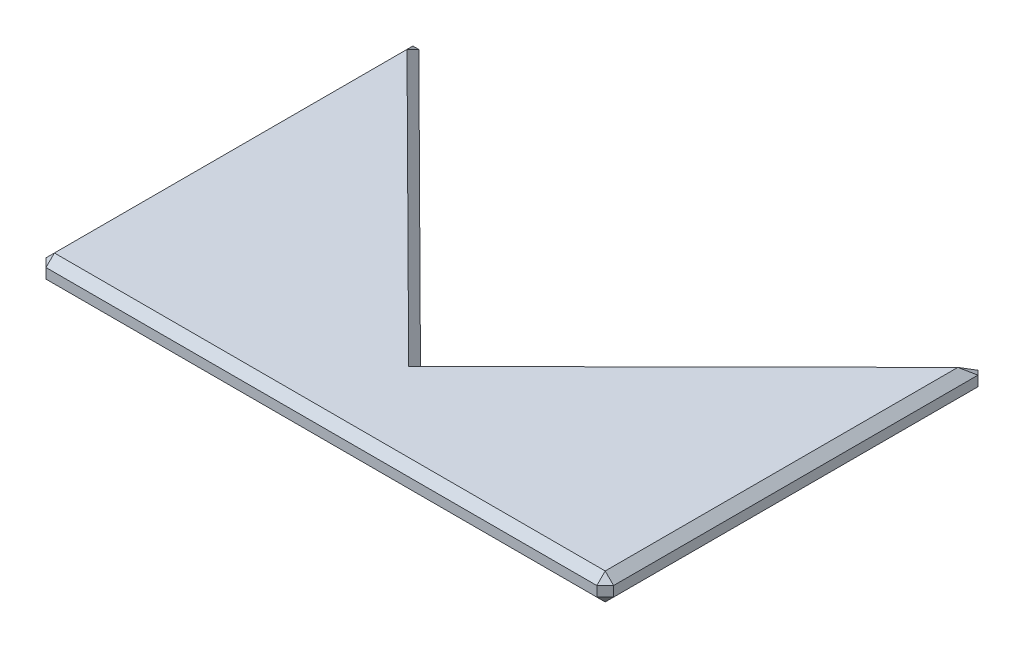
ISO-10303-21;
HEADER;
FILE_DESCRIPTION(('STEP AP214'),'2;1');
FILE_NAME('part.step','',(''),(''),'','','');
FILE_SCHEMA(('AUTOMOTIVE_DESIGN { 1 0 10303 214 1 1 1 1 }'));
ENDSEC;
DATA;
#1=APPLICATION_CONTEXT('core data for automotive mechanical design processes');
#2=APPLICATION_PROTOCOL_DEFINITION('international standard','automotive_design',2000,#1);
#3=PRODUCT_CONTEXT('',#1,'mechanical');
#4=PRODUCT('Part','Part','',(#3));
#5=PRODUCT_RELATED_PRODUCT_CATEGORY('part','',(#4));
#6=PRODUCT_DEFINITION_FORMATION('','',#4);
#7=PRODUCT_DEFINITION_CONTEXT('part definition',#1,'design');
#8=PRODUCT_DEFINITION('design','',#6,#7);
#9=PRODUCT_DEFINITION_SHAPE('','',#8);
#10=(LENGTH_UNIT() NAMED_UNIT(*) SI_UNIT(.MILLI.,.METRE.));
#11=(NAMED_UNIT(*) PLANE_ANGLE_UNIT() SI_UNIT($,.RADIAN.));
#12=(NAMED_UNIT(*) SI_UNIT($,.STERADIAN.) SOLID_ANGLE_UNIT());
#13=UNCERTAINTY_MEASURE_WITH_UNIT(LENGTH_MEASURE(1.E-05),#10,'distance_accuracy_value','');
#14=(GEOMETRIC_REPRESENTATION_CONTEXT(3) GLOBAL_UNCERTAINTY_ASSIGNED_CONTEXT((#13)) GLOBAL_UNIT_ASSIGNED_CONTEXT((#10,
#11,#12)) REPRESENTATION_CONTEXT('',''));
#15=CARTESIAN_POINT('',(0.,0.,0.));
#16=DIRECTION('',(0.,0.,1.));
#17=DIRECTION('',(1.,0.,0.));
#18=AXIS2_PLACEMENT_3D('',#15,#16,#17);
#19=CARTESIAN_POINT('',(0.,1.6,-5.9));
#20=DIRECTION('',(0.705005437622699,0.,0.709201898560929));
#21=DIRECTION('',(0.709201898560929,0.,-0.705005437622699));
#22=AXIS2_PLACEMENT_3D('',#19,#20,#21);
#23=PLANE('',#22);
#24=DIRECTION('',(0.,-1.,0.));
#25=VECTOR('',#24,1.);
#26=CARTESIAN_POINT('',(16.6492581602374,1.6,-22.4507418397626));
#27=LINE('',#26,#25);
#28=CARTESIAN_POINT('',(16.6492581602374,1.1,-22.4507418397626));
#29=VERTEX_POINT('',#28);
#30=CARTESIAN_POINT('',(16.6492581602374,0.499999999999997,-22.4507418397626));
#31=VERTEX_POINT('',#30);
#32=EDGE_CURVE('E203',#29,#31,#27,.T.);
#33=ORIENTED_EDGE('',*,*,#32,.T.);
#34=DIRECTION('',(-0.709201898560929,0.,0.705005437622699));
#35=VECTOR('',#34,1.);
#36=CARTESIAN_POINT('',(0.,0.499999999999997,-5.9));
#37=LINE('',#36,#35);
#38=CARTESIAN_POINT('',(0.,0.499999999999997,-5.9));
#39=VERTEX_POINT('',#38);
#40=EDGE_CURVE('E206',#31,#39,#37,.T.);
#41=ORIENTED_EDGE('',*,*,#40,.T.);
#42=DIRECTION('',(0.,-1.,0.));
#43=VECTOR('',#42,1.);
#44=CARTESIAN_POINT('',(0.,1.6,-5.9));
#45=LINE('',#44,#43);
#46=CARTESIAN_POINT('',(0.,1.1,-5.9));
#47=VERTEX_POINT('',#46);
#48=EDGE_CURVE('E179',#47,#39,#45,.T.);
#49=ORIENTED_EDGE('',*,*,#48,.F.);
#50=DIRECTION('',(0.709201898560929,0.,-0.705005437622699));
#51=VECTOR('',#50,1.);
#52=CARTESIAN_POINT('',(0.,1.1,-5.9));
#53=LINE('',#52,#51);
#54=EDGE_CURVE('E200',#47,#29,#53,.T.);
#55=ORIENTED_EDGE('',*,*,#54,.T.);
#56=EDGE_LOOP('',(#33,#41,#49,#55));
#57=FACE_BOUND('',#56,.T.);
#58=ADVANCED_FACE('F39',(#57),#23,.F.);
#59=CARTESIAN_POINT('',(-16.9,1.6,-22.7));
#60=DIRECTION('',(-0.705005437622699,0.,0.709201898560929));
#61=DIRECTION('',(0.70920189856093,0.,0.705005437622699));
#62=AXIS2_PLACEMENT_3D('',#59,#60,#61);
#63=PLANE('',#62);
#64=ORIENTED_EDGE('',*,*,#48,.T.);
#65=DIRECTION('',(-0.70920189856093,0.,-0.705005437622699));
#66=VECTOR('',#65,1.);
#67=CARTESIAN_POINT('',(-16.9,0.499999999999997,-22.7));
#68=LINE('',#67,#66);
#69=CARTESIAN_POINT('',(-16.5453990507195,0.499999999999997,-22.3474972811886));
#70=VERTEX_POINT('',#69);
#71=EDGE_CURVE('E197',#39,#70,#68,.T.);
#72=ORIENTED_EDGE('',*,*,#71,.T.);
#73=DIRECTION('',(0.,1.,0.));
#74=VECTOR('',#73,1.);
#75=CARTESIAN_POINT('',(-16.5453990507195,1.6,-22.3474972811886));
#76=LINE('',#75,#74);
#77=CARTESIAN_POINT('',(-16.5453990507195,1.1,-22.3474972811886));
#78=VERTEX_POINT('',#77);
#79=EDGE_CURVE('E193',#70,#78,#76,.T.);
#80=ORIENTED_EDGE('',*,*,#79,.T.);
#81=DIRECTION('',(0.70920189856093,0.,0.705005437622699));
#82=VECTOR('',#81,1.);
#83=CARTESIAN_POINT('',(-16.9,1.1,-22.7));
#84=LINE('',#83,#82);
#85=EDGE_CURVE('E190',#78,#47,#84,.T.);
#86=ORIENTED_EDGE('',*,*,#85,.T.);
#87=EDGE_LOOP('',(#64,#72,#80,#86));
#88=FACE_BOUND('',#87,.T.);
#89=ADVANCED_FACE('F388',(#88),#63,.F.);
#90=CARTESIAN_POINT('',(-16.9,1.6,0.));
#91=DIRECTION('',(1.,0.,0.));
#92=DIRECTION('',(0.,0.,-1.));
#93=AXIS2_PLACEMENT_3D('',#90,#91,#92);
#94=PLANE('',#93);
#95=DIRECTION('',(0.,0.,-1.));
#96=VECTOR('',#95,1.);
#97=CARTESIAN_POINT('',(-16.9,1.1,0.));
#98=LINE('',#97,#96);
#99=CARTESIAN_POINT('',(-16.9,1.1,-0.499999999999997));
#100=VERTEX_POINT('',#99);
#101=CARTESIAN_POINT('',(-16.9,1.1,-22.3464450528525));
#102=VERTEX_POINT('',#101);
#103=EDGE_CURVE('E144',#100,#102,#98,.T.);
#104=ORIENTED_EDGE('',*,*,#103,.T.);
#105=DIRECTION('',(0.,-1.,0.));
#106=VECTOR('',#105,1.);
#107=CARTESIAN_POINT('',(-16.9,1.6,-22.3464450528525));
#108=LINE('',#107,#106);
#109=CARTESIAN_POINT('',(-16.9,0.499999999999997,-22.3464450528525));
#110=VERTEX_POINT('',#109);
#111=EDGE_CURVE('E187',#102,#110,#108,.T.);
#112=ORIENTED_EDGE('',*,*,#111,.T.);
#113=DIRECTION('',(0.,0.,1.));
#114=VECTOR('',#113,1.);
#115=CARTESIAN_POINT('',(-16.9,0.499999999999997,0.));
#116=LINE('',#115,#114);
#117=CARTESIAN_POINT('',(-16.9,0.499999999999997,-0.499999999999997));
#118=VERTEX_POINT('',#117);
#119=EDGE_CURVE('E147',#110,#118,#116,.T.);
#120=ORIENTED_EDGE('',*,*,#119,.T.);
#121=DIRECTION('',(0.,1.,0.));
#122=VECTOR('',#121,1.);
#123=CARTESIAN_POINT('',(-16.9,1.6,-0.499999999999997));
#124=LINE('',#123,#122);
#125=EDGE_CURVE('E139',#118,#100,#124,.T.);
#126=ORIENTED_EDGE('',*,*,#125,.T.);
#127=EDGE_LOOP('',(#104,#112,#120,#126));
#128=FACE_BOUND('',#127,.T.);
#129=ADVANCED_FACE('F141',(#128),#94,.F.);
#130=CARTESIAN_POINT('',(16.9,1.6,0.));
#131=DIRECTION('',(0.,0.,-1.));
#132=DIRECTION('',(-1.,0.,0.));
#133=AXIS2_PLACEMENT_3D('',#130,#131,#132);
#134=PLANE('',#133);
#135=DIRECTION('',(0.,-1.,0.));
#136=VECTOR('',#135,1.);
#137=CARTESIAN_POINT('',(-16.4,1.6,0.));
#138=LINE('',#137,#136);
#139=CARTESIAN_POINT('',(-16.4,1.1,0.));
#140=VERTEX_POINT('',#139);
#141=CARTESIAN_POINT('',(-16.4,0.499999999999997,0.));
#142=VERTEX_POINT('',#141);
#143=EDGE_CURVE('E158',#140,#142,#138,.T.);
#144=ORIENTED_EDGE('',*,*,#143,.T.);
#145=DIRECTION('',(1.,0.,0.));
#146=VECTOR('',#145,1.);
#147=CARTESIAN_POINT('',(16.9,0.499999999999997,0.));
#148=LINE('',#147,#146);
#149=CARTESIAN_POINT('',(16.4,0.499999999999997,0.));
#150=VERTEX_POINT('',#149);
#151=EDGE_CURVE('E230',#142,#150,#148,.T.);
#152=ORIENTED_EDGE('',*,*,#151,.T.);
#153=DIRECTION('',(0.,1.,0.));
#154=VECTOR('',#153,1.);
#155=CARTESIAN_POINT('',(16.4,1.6,0.));
#156=LINE('',#155,#154);
#157=CARTESIAN_POINT('',(16.4,1.1,0.));
#158=VERTEX_POINT('',#157);
#159=EDGE_CURVE('E227',#150,#158,#156,.T.);
#160=ORIENTED_EDGE('',*,*,#159,.T.);
#161=DIRECTION('',(-1.,0.,0.));
#162=VECTOR('',#161,1.);
#163=CARTESIAN_POINT('',(16.9,1.1,0.));
#164=LINE('',#163,#162);
#165=EDGE_CURVE('E224',#158,#140,#164,.T.);
#166=ORIENTED_EDGE('',*,*,#165,.T.);
#167=EDGE_LOOP('',(#144,#152,#160,#166));
#168=FACE_BOUND('',#167,.T.);
#169=ADVANCED_FACE('F355',(#168),#134,.F.);
#170=CARTESIAN_POINT('',(16.9,1.6,-22.7));
#171=DIRECTION('',(-1.,0.,0.));
#172=DIRECTION('',(0.,0.,1.));
#173=AXIS2_PLACEMENT_3D('',#170,#171,#172);
#174=PLANE('',#173);
#175=DIRECTION('',(0.,-1.,0.));
#176=VECTOR('',#175,1.);
#177=CARTESIAN_POINT('',(16.9,1.6,-0.5));
#178=LINE('',#177,#176);
#179=CARTESIAN_POINT('',(16.9,1.1,-0.5));
#180=VERTEX_POINT('',#179);
#181=CARTESIAN_POINT('',(16.9,0.5,-0.5));
#182=VERTEX_POINT('',#181);
#183=EDGE_CURVE('E212',#180,#182,#178,.T.);
#184=ORIENTED_EDGE('',*,*,#183,.T.);
#185=DIRECTION('',(0.,0.,-1.));
#186=VECTOR('',#185,1.);
#187=CARTESIAN_POINT('',(16.9,0.5,-22.7));
#188=LINE('',#187,#186);
#189=CARTESIAN_POINT('',(16.9,0.5,-22.2));
#190=VERTEX_POINT('',#189);
#191=EDGE_CURVE('E219',#182,#190,#188,.T.);
#192=ORIENTED_EDGE('',*,*,#191,.T.);
#193=DIRECTION('',(0.,1.,0.));
#194=VECTOR('',#193,1.);
#195=CARTESIAN_POINT('',(16.9,1.6,-22.2));
#196=LINE('',#195,#194);
#197=CARTESIAN_POINT('',(16.9,1.1,-22.2));
#198=VERTEX_POINT('',#197);
#199=EDGE_CURVE('E215',#190,#198,#196,.T.);
#200=ORIENTED_EDGE('',*,*,#199,.T.);
#201=DIRECTION('',(0.,0.,1.));
#202=VECTOR('',#201,1.);
#203=CARTESIAN_POINT('',(16.9,1.1,-22.7));
#204=LINE('',#203,#202);
#205=EDGE_CURVE('E209',#198,#180,#204,.T.);
#206=ORIENTED_EDGE('',*,*,#205,.T.);
#207=EDGE_LOOP('',(#184,#192,#200,#206));
#208=FACE_BOUND('',#207,.T.);
#209=ADVANCED_FACE('F363',(#208),#174,.F.);
#210=CARTESIAN_POINT('',(0.,1.6,0.));
#211=DIRECTION('',(0.,-1.,0.));
#212=DIRECTION('',(0.,0.,-1.));
#213=AXIS2_PLACEMENT_3D('',#210,#211,#212);
#214=PLANE('',#213);
#215=DIRECTION('',(0.,0.,1.));
#216=VECTOR('',#215,1.);
#217=CARTESIAN_POINT('',(-16.4,1.6,0.));
#218=LINE('',#217,#216);
#219=CARTESIAN_POINT('',(-16.4,1.6,-21.4979407266941));
#220=VERTEX_POINT('',#219);
#221=CARTESIAN_POINT('',(-16.4,1.6,-0.499999999999993));
#222=VERTEX_POINT('',#221);
#223=EDGE_CURVE('E49',#220,#222,#218,.T.);
#224=ORIENTED_EDGE('',*,*,#223,.T.);
#225=DIRECTION('',(1.,0.,0.));
#226=VECTOR('',#225,1.);
#227=CARTESIAN_POINT('',(0.,1.6,-0.499999999999995));
#228=LINE('',#227,#226);
#229=CARTESIAN_POINT('',(16.4,1.6,-0.499999999999997));
#230=VERTEX_POINT('',#229);
#231=EDGE_CURVE('E11',#222,#230,#228,.T.);
#232=ORIENTED_EDGE('',*,*,#231,.T.);
#233=DIRECTION('',(0.,0.,-1.));
#234=VECTOR('',#233,1.);
#235=CARTESIAN_POINT('',(16.4,1.6,0.));
#236=LINE('',#235,#234);
#237=CARTESIAN_POINT('',(16.4,1.6,-21.4979407266941));
#238=VERTEX_POINT('',#237);
#239=EDGE_CURVE('E250',#230,#238,#236,.T.);
#240=ORIENTED_EDGE('',*,*,#239,.T.);
#241=DIRECTION('',(-0.709201898560929,0.,0.705005437622699));
#242=VECTOR('',#241,1.);
#243=CARTESIAN_POINT('',(-2.59744533084965,1.6,-2.61290631496185));
#244=LINE('',#243,#242);
#245=CARTESIAN_POINT('',(0.,1.6,-5.1949821468124));
#246=VERTEX_POINT('',#245);
#247=EDGE_CURVE('E253',#238,#246,#244,.T.);
#248=ORIENTED_EDGE('',*,*,#247,.T.);
#249=DIRECTION('',(-0.70920189856093,0.,-0.705005437622699));
#250=VECTOR('',#249,1.);
#251=CARTESIAN_POINT('',(2.59744533084965,1.6,-2.61290631496186));
#252=LINE('',#251,#250);
#253=EDGE_CURVE('E60',#246,#220,#252,.T.);
#254=ORIENTED_EDGE('',*,*,#253,.T.);
#255=EDGE_LOOP('',(#224,#232,#240,#248,#254));
#256=FACE_BOUND('',#255,.T.);
#257=ADVANCED_FACE('F351',(#256),#214,.F.);
#258=CARTESIAN_POINT('',(0.,0.,0.));
#259=DIRECTION('',(0.,-1.,0.));
#260=DIRECTION('',(0.,0.,-1.));
#261=AXIS2_PLACEMENT_3D('',#258,#259,#260);
#262=PLANE('',#261);
#263=DIRECTION('',(0.,0.,1.));
#264=VECTOR('',#263,1.);
#265=CARTESIAN_POINT('',(16.4,0.,0.));
#266=LINE('',#265,#264);
#267=CARTESIAN_POINT('',(16.4,0.,-21.4979407266941));
#268=VERTEX_POINT('',#267);
#269=CARTESIAN_POINT('',(16.4,0.,-0.5));
#270=VERTEX_POINT('',#269);
#271=EDGE_CURVE('E243',#268,#270,#266,.T.);
#272=ORIENTED_EDGE('',*,*,#271,.T.);
#273=DIRECTION('',(-1.,0.,0.));
#274=VECTOR('',#273,1.);
#275=CARTESIAN_POINT('',(-16.9,0.,-0.499999999999996));
#276=LINE('',#275,#274);
#277=CARTESIAN_POINT('',(-16.4,0.,-0.499999999999997));
#278=VERTEX_POINT('',#277);
#279=EDGE_CURVE('E246',#270,#278,#276,.T.);
#280=ORIENTED_EDGE('',*,*,#279,.T.);
#281=DIRECTION('',(0.,0.,-1.));
#282=VECTOR('',#281,1.);
#283=CARTESIAN_POINT('',(-16.4,0.,-22.7));
#284=LINE('',#283,#282);
#285=CARTESIAN_POINT('',(-16.4,0.,-21.497940726694));
#286=VERTEX_POINT('',#285);
#287=EDGE_CURVE('E234',#278,#286,#284,.T.);
#288=ORIENTED_EDGE('',*,*,#287,.T.);
#289=DIRECTION('',(0.70920189856093,0.,0.705005437622699));
#290=VECTOR('',#289,1.);
#291=CARTESIAN_POINT('',(-0.352502718811347,0.,-5.54539905071954));
#292=LINE('',#291,#290);
#293=CARTESIAN_POINT('',(0.,0.,-5.19498214681239));
#294=VERTEX_POINT('',#293);
#295=EDGE_CURVE('E237',#286,#294,#292,.T.);
#296=ORIENTED_EDGE('',*,*,#295,.T.);
#297=DIRECTION('',(0.709201898560929,0.,-0.705005437622699));
#298=VECTOR('',#297,1.);
#299=CARTESIAN_POINT('',(17.2525027188113,0.,-22.3453990507195));
#300=LINE('',#299,#298);
#301=EDGE_CURVE('E240',#294,#268,#300,.T.);
#302=ORIENTED_EDGE('',*,*,#301,.T.);
#303=EDGE_LOOP('',(#272,#280,#288,#296,#302));
#304=FACE_BOUND('',#303,.T.);
#305=ADVANCED_FACE('F592',(#304),#262,.T.);
#306=CARTESIAN_POINT('',(16.9,1.6,-0.5));
#307=DIRECTION('',(-0.70710678118655,0.,-0.707106781186545));
#308=DIRECTION('',(0.,-1.,0.));
#309=AXIS2_PLACEMENT_3D('',#306,#307,#308);
#310=PLANE('',#309);
#311=DIRECTION('',(0.707106781186545,0.,-0.70710678118655));
#312=VECTOR('',#311,1.);
#313=CARTESIAN_POINT('',(16.4,0.499999999999997,0.));
#314=LINE('',#313,#312);
#315=EDGE_CURVE('E331',#182,#150,#314,.F.);
#316=ORIENTED_EDGE('',*,*,#315,.F.);
#317=ORIENTED_EDGE('',*,*,#183,.F.);
#318=DIRECTION('',(-0.707106781186545,0.,0.70710678118655));
#319=VECTOR('',#318,1.);
#320=CARTESIAN_POINT('',(16.4,1.1,0.));
#321=LINE('',#320,#319);
#322=EDGE_CURVE('E334',#158,#180,#321,.F.);
#323=ORIENTED_EDGE('',*,*,#322,.F.);
#324=ORIENTED_EDGE('',*,*,#159,.F.);
#325=EDGE_LOOP('',(#316,#317,#323,#324));
#326=FACE_BOUND('',#325,.T.);
#327=ADVANCED_FACE('F41',(#326),#310,.F.);
#328=CARTESIAN_POINT('',(16.4,1.6,0.));
#329=DIRECTION('',(-0.70710678118655,-0.707106781186545,0.));
#330=DIRECTION('',(0.,0.,-1.));
#331=AXIS2_PLACEMENT_3D('',#328,#329,#330);
#332=PLANE('',#331);
#333=DIRECTION('',(0.707106781186545,-0.70710678118655,0.));
#334=VECTOR('',#333,1.);
#335=CARTESIAN_POINT('',(16.65,1.35,-0.499999999999998));
#336=LINE('',#335,#334);
#337=EDGE_CURVE('E43',#180,#230,#336,.F.);
#338=ORIENTED_EDGE('',*,*,#337,.F.);
#339=ORIENTED_EDGE('',*,*,#205,.F.);
#340=DIRECTION('',(-0.501787736693264,0.501787736693267,0.704569467553413));
#341=VECTOR('',#340,1.);
#342=CARTESIAN_POINT('',(16.9,1.1,-22.2));
#343=LINE('',#342,#341);
#344=EDGE_CURVE('E320',#238,#198,#343,.F.);
#345=ORIENTED_EDGE('',*,*,#344,.F.);
#346=ORIENTED_EDGE('',*,*,#239,.F.);
#347=EDGE_LOOP('',(#338,#339,#345,#346));
#348=FACE_BOUND('',#347,.T.);
#349=ADVANCED_FACE('F349',(#348),#332,.F.);
#350=CARTESIAN_POINT('',(16.4,1.1,0.));
#351=DIRECTION('',(0.57735026918963,0.577350269189622,0.577350269189626));
#352=DIRECTION('',(0.707106781186545,0.,-0.70710678118655));
#353=AXIS2_PLACEMENT_3D('',#350,#351,#352);
#354=PLANE('',#353);
#355=ORIENTED_EDGE('',*,*,#322,.T.);
#356=ORIENTED_EDGE('',*,*,#337,.T.);
#357=DIRECTION('',(0.,0.70710678118655,-0.707106781186546));
#358=VECTOR('',#357,1.);
#359=CARTESIAN_POINT('',(16.4,1.1,0.));
#360=LINE('',#359,#358);
#361=EDGE_CURVE('E317',#158,#230,#360,.T.);
#362=ORIENTED_EDGE('',*,*,#361,.F.);
#363=EDGE_LOOP('',(#355,#356,#362));
#364=FACE_BOUND('',#363,.T.);
#365=ADVANCED_FACE('F344',(#364),#354,.T.);
#366=CARTESIAN_POINT('',(16.4,0.499999999999997,0.));
#367=DIRECTION('',(0.57735026918963,-0.577350269189626,0.577350269189622));
#368=DIRECTION('',(0.707106781186545,0.70710678118655,0.));
#369=AXIS2_PLACEMENT_3D('',#366,#367,#368);
#370=PLANE('',#369);
#371=DIRECTION('',(0.,-0.707106781186545,-0.70710678118655));
#372=VECTOR('',#371,1.);
#373=CARTESIAN_POINT('',(16.4,0.499999999999997,0.));
#374=LINE('',#373,#372);
#375=EDGE_CURVE('E314',#270,#150,#374,.F.);
#376=ORIENTED_EDGE('',*,*,#375,.F.);
#377=DIRECTION('',(0.707106781186545,0.70710678118655,0.));
#378=VECTOR('',#377,1.);
#379=CARTESIAN_POINT('',(16.65,0.25,-0.5));
#380=LINE('',#379,#378);
#381=EDGE_CURVE('E327',#182,#270,#380,.F.);
#382=ORIENTED_EDGE('',*,*,#381,.F.);
#383=ORIENTED_EDGE('',*,*,#315,.T.);
#384=EDGE_LOOP('',(#376,#382,#383));
#385=FACE_BOUND('',#384,.T.);
#386=ADVANCED_FACE('F563',(#385),#370,.T.);
#387=CARTESIAN_POINT('',(16.9,0.5,-22.7));
#388=DIRECTION('',(0.70710678118655,-0.707106781186545,0.));
#389=DIRECTION('',(0.,0.,1.));
#390=AXIS2_PLACEMENT_3D('',#387,#388,#389);
#391=PLANE('',#390);
#392=ORIENTED_EDGE('',*,*,#381,.T.);
#393=ORIENTED_EDGE('',*,*,#271,.F.);
#394=DIRECTION('',(-0.501787736693261,-0.501787736693265,0.704569467553417));
#395=VECTOR('',#394,1.);
#396=CARTESIAN_POINT('',(16.9255138311503,0.525513831150309,-22.2358244435133));
#397=LINE('',#396,#395);
#398=EDGE_CURVE('E310',#190,#268,#397,.T.);
#399=ORIENTED_EDGE('',*,*,#398,.F.);
#400=ORIENTED_EDGE('',*,*,#191,.F.);
#401=EDGE_LOOP('',(#392,#393,#399,#400));
#402=FACE_BOUND('',#401,.T.);
#403=ADVANCED_FACE('F375',(#402),#391,.T.);
#404=CARTESIAN_POINT('',(16.6492581602374,1.6,-22.4507418397626));
#405=DIRECTION('',(-0.707106781186543,0.,0.707106781186552));
#406=DIRECTION('',(0.,-1.,0.));
#407=AXIS2_PLACEMENT_3D('',#404,#405,#406);
#408=PLANE('',#407);
#409=DIRECTION('',(0.707106781186552,0.,0.707106781186543));
#410=VECTOR('',#409,1.);
#411=CARTESIAN_POINT('',(16.9,1.1,-22.2));
#412=LINE('',#411,#410);
#413=EDGE_CURVE('E323',#198,#29,#412,.F.);
#414=ORIENTED_EDGE('',*,*,#413,.F.);
#415=ORIENTED_EDGE('',*,*,#199,.F.);
#416=DIRECTION('',(-0.707106781186552,0.,-0.707106781186543));
#417=VECTOR('',#416,1.);
#418=CARTESIAN_POINT('',(16.6492581602374,0.499999999999997,-22.4507418397626));
#419=LINE('',#418,#417);
#420=EDGE_CURVE('E306',#31,#190,#419,.F.);
#421=ORIENTED_EDGE('',*,*,#420,.F.);
#422=ORIENTED_EDGE('',*,*,#32,.F.);
#423=EDGE_LOOP('',(#414,#415,#421,#422));
#424=FACE_BOUND('',#423,.T.);
#425=ADVANCED_FACE('F370',(#424),#408,.F.);
#426=CARTESIAN_POINT('',(16.9,1.1,-22.2));
#427=DIRECTION('',(0.358522300877464,0.861930112913485,-0.358522300877473));
#428=DIRECTION('',(0.,0.384053747786239,0.923310737948684));
#429=AXIS2_PLACEMENT_3D('',#426,#427,#428);
#430=PLANE('',#429);
#431=ORIENTED_EDGE('',*,*,#344,.T.);
#432=ORIENTED_EDGE('',*,*,#413,.T.);
#433=DIRECTION('',(0.225671472286636,-0.452686227146421,-0.862639882191822));
#434=VECTOR('',#433,1.);
#435=CARTESIAN_POINT('',(16.6132151243206,1.17230061371402,-22.3129656293181));
#436=LINE('',#435,#434);
#437=EDGE_CURVE('E302',#238,#29,#436,.T.);
#438=ORIENTED_EDGE('',*,*,#437,.F.);
#439=EDGE_LOOP('',(#431,#432,#438));
#440=FACE_BOUND('',#439,.T.);
#441=ADVANCED_FACE('F400',(#440),#430,.T.);
#442=CARTESIAN_POINT('',(0.,1.6,-0.499999999999995));
#443=DIRECTION('',(0.,-0.707106781186545,-0.70710678118655));
#444=DIRECTION('',(1.,0.,0.));
#445=AXIS2_PLACEMENT_3D('',#442,#443,#444);
#446=PLANE('',#445);
#447=ORIENTED_EDGE('',*,*,#361,.T.);
#448=ORIENTED_EDGE('',*,*,#231,.F.);
#449=DIRECTION('',(0.,-0.70710678118655,0.707106781186545));
#450=VECTOR('',#449,1.);
#451=CARTESIAN_POINT('',(-16.4,1.1,0.));
#452=LINE('',#451,#450);
#453=EDGE_CURVE('E163',#140,#222,#452,.F.);
#454=ORIENTED_EDGE('',*,*,#453,.F.);
#455=ORIENTED_EDGE('',*,*,#165,.F.);
#456=EDGE_LOOP('',(#447,#448,#454,#455));
#457=FACE_BOUND('',#456,.T.);
#458=ADVANCED_FACE('F353',(#457),#446,.F.);
#459=CARTESIAN_POINT('',(-16.4,1.6,0.));
#460=DIRECTION('',(0.707106781186547,0.,-0.707106781186548));
#461=DIRECTION('',(0.,-1.,0.));
#462=AXIS2_PLACEMENT_3D('',#459,#460,#461);
#463=PLANE('',#462);
#464=DIRECTION('',(0.707106781186548,0.,0.707106781186547));
#465=VECTOR('',#464,1.);
#466=CARTESIAN_POINT('',(-16.65,0.499999999999997,-0.249999999999996));
#467=LINE('',#466,#465);
#468=EDGE_CURVE('E164',#142,#118,#467,.F.);
#469=ORIENTED_EDGE('',*,*,#468,.F.);
#470=ORIENTED_EDGE('',*,*,#143,.F.);
#471=DIRECTION('',(-0.707106781186548,0.,-0.707106781186547));
#472=VECTOR('',#471,1.);
#473=CARTESIAN_POINT('',(-16.4,1.1,0.));
#474=LINE('',#473,#472);
#475=EDGE_CURVE('E155',#100,#140,#474,.F.);
#476=ORIENTED_EDGE('',*,*,#475,.F.);
#477=ORIENTED_EDGE('',*,*,#125,.F.);
#478=EDGE_LOOP('',(#469,#470,#476,#477));
#479=FACE_BOUND('',#478,.T.);
#480=ADVANCED_FACE('F157',(#479),#463,.F.);
#481=CARTESIAN_POINT('',(16.9,0.499999999999997,0.));
#482=DIRECTION('',(0.,-0.70710678118655,0.707106781186545));
#483=DIRECTION('',(-1.,0.,0.));
#484=AXIS2_PLACEMENT_3D('',#481,#482,#483);
#485=PLANE('',#484);
#486=ORIENTED_EDGE('',*,*,#375,.T.);
#487=ORIENTED_EDGE('',*,*,#151,.F.);
#488=DIRECTION('',(0.,0.707106781186545,0.70710678118655));
#489=VECTOR('',#488,1.);
#490=CARTESIAN_POINT('',(-16.4,0.,-0.499999999999997));
#491=LINE('',#490,#489);
#492=EDGE_CURVE('E294',#278,#142,#491,.T.);
#493=ORIENTED_EDGE('',*,*,#492,.F.);
#494=ORIENTED_EDGE('',*,*,#279,.F.);
#495=EDGE_LOOP('',(#486,#487,#493,#494));
#496=FACE_BOUND('',#495,.T.);
#497=ADVANCED_FACE('F453',(#496),#485,.T.);
#498=CARTESIAN_POINT('',(16.6492581602374,0.499999999999997,-22.4507418397626));
#499=DIRECTION('',(0.358522300877471,-0.861930112913485,-0.358522300877464));
#500=DIRECTION('',(0.923310737948685,0.384053747786237,0.));
#501=AXIS2_PLACEMENT_3D('',#498,#499,#500);
#502=PLANE('',#501);
#503=ORIENTED_EDGE('',*,*,#420,.T.);
#504=ORIENTED_EDGE('',*,*,#398,.T.);
#505=DIRECTION('',(0.225671472286636,0.452686227146415,-0.862639882191825));
#506=VECTOR('',#505,1.);
#507=CARTESIAN_POINT('',(16.6492581602374,0.499999999999997,-22.4507418397626));
#508=LINE('',#507,#506);
#509=EDGE_CURVE('E290',#31,#268,#508,.F.);
#510=ORIENTED_EDGE('',*,*,#509,.F.);
#511=EDGE_LOOP('',(#503,#504,#510));
#512=FACE_BOUND('',#511,.T.);
#513=ADVANCED_FACE('F377',(#512),#502,.T.);
#514=CARTESIAN_POINT('',(-2.59744533084965,1.6,-2.61290631496185));
#515=DIRECTION('',(0.498514125716401,-0.707106781186545,0.501481471702809));
#516=DIRECTION('',(-0.709201898560929,0.,0.705005437622699));
#517=AXIS2_PLACEMENT_3D('',#514,#515,#516);
#518=PLANE('',#517);
#519=ORIENTED_EDGE('',*,*,#437,.T.);
#520=ORIENTED_EDGE('',*,*,#54,.F.);
#521=DIRECTION('',(0.,0.578489018226175,0.815690171444842));
#522=VECTOR('',#521,1.);
#523=CARTESIAN_POINT('',(0.,2.81839845887802,-3.47699681520187));
#524=LINE('',#523,#522);
#525=EDGE_CURVE('E171',#246,#47,#524,.F.);
#526=ORIENTED_EDGE('',*,*,#525,.F.);
#527=ORIENTED_EDGE('',*,*,#247,.F.);
#528=EDGE_LOOP('',(#519,#520,#526,#527));
#529=FACE_BOUND('',#528,.T.);
#530=ADVANCED_FACE('F398',(#529),#518,.F.);
#531=CARTESIAN_POINT('',(-16.4,1.1,0.));
#532=DIRECTION('',(-0.57735026918963,0.577350269189618,0.57735026918963));
#533=DIRECTION('',(0.707106781186548,0.,0.707106781186548));
#534=AXIS2_PLACEMENT_3D('',#531,#532,#533);
#535=PLANE('',#534);
#536=ORIENTED_EDGE('',*,*,#475,.T.);
#537=ORIENTED_EDGE('',*,*,#453,.T.);
#538=DIRECTION('',(0.707106781186543,0.707106781186552,0.));
#539=VECTOR('',#538,1.);
#540=CARTESIAN_POINT('',(-16.65,1.35,-0.499999999999995));
#541=LINE('',#540,#539);
#542=EDGE_CURVE('E167',#100,#222,#541,.T.);
#543=ORIENTED_EDGE('',*,*,#542,.F.);
#544=EDGE_LOOP('',(#536,#537,#543));
#545=FACE_BOUND('',#544,.T.);
#546=ADVANCED_FACE('F168',(#545),#535,.T.);
#547=CARTESIAN_POINT('',(-16.4,0.,-0.499999999999997));
#548=DIRECTION('',(-0.577350269189624,-0.577350269189629,0.577350269189624));
#549=DIRECTION('',(0.,-0.707106781186545,-0.70710678118655));
#550=AXIS2_PLACEMENT_3D('',#547,#548,#549);
#551=PLANE('',#550);
#552=ORIENTED_EDGE('',*,*,#492,.T.);
#553=ORIENTED_EDGE('',*,*,#468,.T.);
#554=DIRECTION('',(0.70710678118655,-0.707106781186545,0.));
#555=VECTOR('',#554,1.);
#556=CARTESIAN_POINT('',(-16.4,0.,-0.499999999999997));
#557=LINE('',#556,#555);
#558=EDGE_CURVE('E172',#278,#118,#557,.F.);
#559=ORIENTED_EDGE('',*,*,#558,.F.);
#560=EDGE_LOOP('',(#552,#553,#559));
#561=FACE_BOUND('',#560,.T.);
#562=ADVANCED_FACE('F443',(#561),#551,.T.);
#563=CARTESIAN_POINT('',(0.,0.499999999999997,-5.9));
#564=DIRECTION('',(-0.498514125716397,-0.707106781186551,-0.501481471702804));
#565=DIRECTION('',(0.709201898560929,0.,-0.705005437622699));
#566=AXIS2_PLACEMENT_3D('',#563,#564,#565);
#567=PLANE('',#566);
#568=ORIENTED_EDGE('',*,*,#509,.T.);
#569=ORIENTED_EDGE('',*,*,#301,.F.);
#570=DIRECTION('',(0.,-0.578489018226171,0.815690171444845));
#571=VECTOR('',#570,1.);
#572=CARTESIAN_POINT('',(0.,0.499999999999996,-5.9));
#573=LINE('',#572,#571);
#574=EDGE_CURVE('E280',#39,#294,#573,.T.);
#575=ORIENTED_EDGE('',*,*,#574,.F.);
#576=ORIENTED_EDGE('',*,*,#40,.F.);
#577=EDGE_LOOP('',(#568,#569,#575,#576));
#578=FACE_BOUND('',#577,.T.);
#579=ADVANCED_FACE('F382',(#578),#567,.T.);
#580=CARTESIAN_POINT('',(2.59744533084965,1.6,-2.61290631496186));
#581=DIRECTION('',(-0.498514125716401,-0.707106781186545,0.501481471702809));
#582=DIRECTION('',(-0.709201898560929,0.,-0.705005437622699));
#583=AXIS2_PLACEMENT_3D('',#580,#581,#582);
#584=PLANE('',#583);
#585=ORIENTED_EDGE('',*,*,#525,.T.);
#586=ORIENTED_EDGE('',*,*,#85,.F.);
#587=DIRECTION('',(0.145918921155803,0.501787736693268,0.85259412134554));
#588=VECTOR('',#587,1.);
#589=CARTESIAN_POINT('',(-16.5453990507195,1.1,-22.3474972811886));
#590=LINE('',#589,#588);
#591=EDGE_CURVE('E276',#220,#78,#590,.F.);
#592=ORIENTED_EDGE('',*,*,#591,.F.);
#593=ORIENTED_EDGE('',*,*,#253,.F.);
#594=EDGE_LOOP('',(#585,#586,#592,#593));
#595=FACE_BOUND('',#594,.T.);
#596=ADVANCED_FACE('F394',(#595),#584,.F.);
#597=CARTESIAN_POINT('',(-16.4,1.6,0.));
#598=DIRECTION('',(0.707106781186552,-0.707106781186543,0.));
#599=DIRECTION('',(0.,0.,1.));
#600=AXIS2_PLACEMENT_3D('',#597,#598,#599);
#601=PLANE('',#600);
#602=ORIENTED_EDGE('',*,*,#542,.T.);
#603=ORIENTED_EDGE('',*,*,#223,.F.);
#604=DIRECTION('',(-0.452686227146415,-0.452686227146421,-0.768212444252164));
#605=VECTOR('',#604,1.);
#606=CARTESIAN_POINT('',(-16.827699386286,1.17230061371402,-22.223750285812));
#607=LINE('',#606,#605);
#608=EDGE_CURVE('E176',#102,#220,#607,.F.);
#609=ORIENTED_EDGE('',*,*,#608,.F.);
#610=ORIENTED_EDGE('',*,*,#103,.F.);
#611=EDGE_LOOP('',(#602,#603,#609,#610));
#612=FACE_BOUND('',#611,.T.);
#613=ADVANCED_FACE('F174',(#612),#601,.F.);
#614=CARTESIAN_POINT('',(-16.9,0.499999999999997,0.));
#615=DIRECTION('',(-0.707106781186545,-0.70710678118655,0.));
#616=DIRECTION('',(0.,0.,-1.));
#617=AXIS2_PLACEMENT_3D('',#614,#615,#616);
#618=PLANE('',#617);
#619=ORIENTED_EDGE('',*,*,#558,.T.);
#620=ORIENTED_EDGE('',*,*,#119,.F.);
#621=DIRECTION('',(-0.452686227146417,0.452686227146414,-0.768212444252166));
#622=VECTOR('',#621,1.);
#623=CARTESIAN_POINT('',(-16.9,0.499999999999997,-22.3464450528525));
#624=LINE('',#623,#622);
#625=EDGE_CURVE('E270',#286,#110,#624,.T.);
#626=ORIENTED_EDGE('',*,*,#625,.F.);
#627=ORIENTED_EDGE('',*,*,#287,.F.);
#628=EDGE_LOOP('',(#619,#620,#626,#627));
#629=FACE_BOUND('',#628,.T.);
#630=ADVANCED_FACE('F432',(#629),#618,.T.);
#631=CARTESIAN_POINT('',(-16.9,0.499999999999997,-22.7));
#632=DIRECTION('',(0.4985141257164,-0.707106781186548,-0.501481471702807));
#633=DIRECTION('',(0.709201898560929,0.,0.705005437622699));
#634=AXIS2_PLACEMENT_3D('',#631,#632,#633);
#635=PLANE('',#634);
#636=ORIENTED_EDGE('',*,*,#574,.T.);
#637=ORIENTED_EDGE('',*,*,#295,.F.);
#638=DIRECTION('',(0.145918921155816,-0.501787736693259,0.852594121345544));
#639=VECTOR('',#638,1.);
#640=CARTESIAN_POINT('',(-16.5528184243785,0.525513831150307,-22.3908481661567));
#641=LINE('',#640,#639);
#642=EDGE_CURVE('E266',#70,#286,#641,.T.);
#643=ORIENTED_EDGE('',*,*,#642,.F.);
#644=ORIENTED_EDGE('',*,*,#71,.F.);
#645=EDGE_LOOP('',(#636,#637,#643,#644));
#646=FACE_BOUND('',#645,.T.);
#647=ADVANCED_FACE('F428',(#646),#635,.T.);
#648=CARTESIAN_POINT('',(-16.5453990507195,1.1,-22.3474972811886));
#649=DIRECTION('',(-0.00150452483111537,0.861930112913483,-0.507024868086352));
#650=DIRECTION('',(0.,0.507025441936796,0.861931088445472));
#651=AXIS2_PLACEMENT_3D('',#648,#649,#650);
#652=PLANE('',#651);
#653=ORIENTED_EDGE('',*,*,#608,.T.);
#654=ORIENTED_EDGE('',*,*,#591,.T.);
#655=DIRECTION('',(0.999995597419207,0.,-0.00296734598641478));
#656=VECTOR('',#655,1.);
#657=CARTESIAN_POINT('',(-16.5453990507195,1.1,-22.3474972811886));
#658=LINE('',#657,#656);
#659=EDGE_CURVE('E263',#102,#78,#658,.T.);
#660=ORIENTED_EDGE('',*,*,#659,.F.);
#661=EDGE_LOOP('',(#653,#654,#660));
#662=FACE_BOUND('',#661,.T.);
#663=ADVANCED_FACE('F424',(#662),#652,.T.);
#664=CARTESIAN_POINT('',(-16.9,0.499999999999997,-22.3464450528525));
#665=DIRECTION('',(-0.00150452483112062,-0.861930112913489,-0.507024868086343));
#666=DIRECTION('',(0.,0.507025441936787,-0.861931088445478));
#667=AXIS2_PLACEMENT_3D('',#664,#665,#666);
#668=PLANE('',#667);
#669=ORIENTED_EDGE('',*,*,#642,.T.);
#670=ORIENTED_EDGE('',*,*,#625,.T.);
#671=DIRECTION('',(-0.999995597419207,0.,0.00296734598641478));
#672=VECTOR('',#671,1.);
#673=CARTESIAN_POINT('',(-16.9,0.499999999999997,-22.3464450528525));
#674=LINE('',#673,#672);
#675=EDGE_CURVE('E260',#70,#110,#674,.T.);
#676=ORIENTED_EDGE('',*,*,#675,.F.);
#677=EDGE_LOOP('',(#669,#670,#676));
#678=FACE_BOUND('',#677,.T.);
#679=ADVANCED_FACE('F420',(#678),#668,.T.);
#680=CARTESIAN_POINT('',(-16.9,1.6,-22.3464450528525));
#681=DIRECTION('',(0.00296734598641478,0.,0.999995597419207));
#682=DIRECTION('',(0.,-1.,0.));
#683=AXIS2_PLACEMENT_3D('',#680,#681,#682);
#684=PLANE('',#683);
#685=ORIENTED_EDGE('',*,*,#659,.T.);
#686=ORIENTED_EDGE('',*,*,#79,.F.);
#687=ORIENTED_EDGE('',*,*,#675,.T.);
#688=ORIENTED_EDGE('',*,*,#111,.F.);
#689=EDGE_LOOP('',(#685,#686,#687,#688));
#690=FACE_BOUND('',#689,.T.);
#691=ADVANCED_FACE('F417',(#690),#684,.F.);
#692=CLOSED_SHELL('',(#58,#89,#129,#169,#209,#257,#305,#327,#349,#365,#386,#403,#425,#441,#458,
#480,#497,#513,#530,#546,#562,#579,#596,#613,#630,#647,#663,#679,#691));
#693=MANIFOLD_SOLID_BREP('B2',#692);
#694=ADVANCED_BREP_SHAPE_REPRESENTATION('',(#18,#693),#14);
#695=SHAPE_DEFINITION_REPRESENTATION(#9,#694);
ENDSEC;
END-ISO-10303-21;
